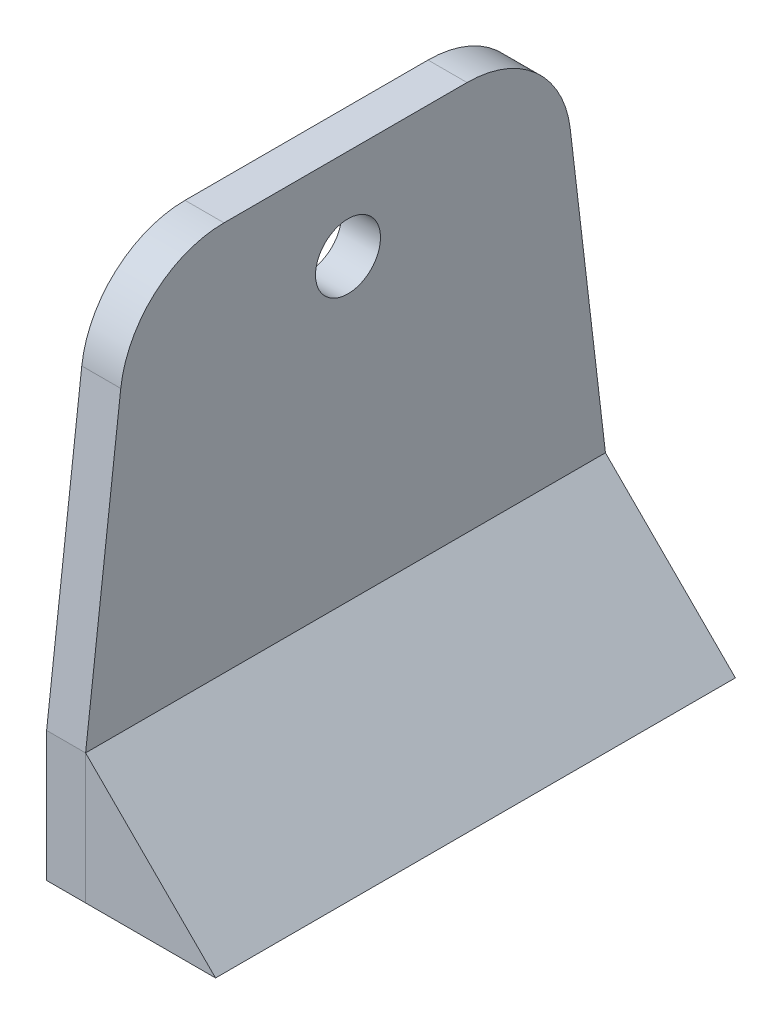
ISO-10303-21;
HEADER;
FILE_DESCRIPTION(('STEP AP214'),'2;1');
FILE_NAME('part.step','',(''),(''),'','','');
FILE_SCHEMA(('AUTOMOTIVE_DESIGN { 1 0 10303 214 1 1 1 1 }'));
ENDSEC;
DATA;
#1=APPLICATION_CONTEXT('core data for automotive mechanical design processes');
#2=APPLICATION_PROTOCOL_DEFINITION('international standard','automotive_design',2000,#1);
#3=PRODUCT_CONTEXT('',#1,'mechanical');
#4=PRODUCT('Part','Part','',(#3));
#5=PRODUCT_RELATED_PRODUCT_CATEGORY('part','',(#4));
#6=PRODUCT_DEFINITION_FORMATION('','',#4);
#7=PRODUCT_DEFINITION_CONTEXT('part definition',#1,'design');
#8=PRODUCT_DEFINITION('design','',#6,#7);
#9=PRODUCT_DEFINITION_SHAPE('','',#8);
#10=(LENGTH_UNIT() NAMED_UNIT(*) SI_UNIT(.MILLI.,.METRE.));
#11=(NAMED_UNIT(*) PLANE_ANGLE_UNIT() SI_UNIT($,.RADIAN.));
#12=(NAMED_UNIT(*) SI_UNIT($,.STERADIAN.) SOLID_ANGLE_UNIT());
#13=UNCERTAINTY_MEASURE_WITH_UNIT(LENGTH_MEASURE(1.E-05),#10,'distance_accuracy_value','');
#14=(GEOMETRIC_REPRESENTATION_CONTEXT(3) GLOBAL_UNCERTAINTY_ASSIGNED_CONTEXT((#13)) GLOBAL_UNIT_ASSIGNED_CONTEXT((#10,
#11,#12)) REPRESENTATION_CONTEXT('',''));
#15=CARTESIAN_POINT('',(0.,0.,0.));
#16=DIRECTION('',(0.,0.,1.));
#17=DIRECTION('',(1.,0.,0.));
#18=AXIS2_PLACEMENT_3D('',#15,#16,#17);
#19=CARTESIAN_POINT('',(-18.65,10.,20.));
#20=DIRECTION('',(1.,0.,0.));
#21=DIRECTION('',(0.,0.,-1.));
#22=AXIS2_PLACEMENT_3D('',#19,#20,#21);
#23=PLANE('',#22);
#24=DIRECTION('',(0.,-1.,0.));
#25=VECTOR('',#24,1.);
#26=CARTESIAN_POINT('',(-18.65,10.,-20.));
#27=LINE('',#26,#25);
#28=CARTESIAN_POINT('',(-18.65,10.,-20.));
#29=VERTEX_POINT('',#28);
#30=CARTESIAN_POINT('',(-18.65,0.,-20.));
#31=VERTEX_POINT('',#30);
#32=EDGE_CURVE('E96',#29,#31,#27,.T.);
#33=ORIENTED_EDGE('',*,*,#32,.T.);
#34=DIRECTION('',(0.,0.,-1.));
#35=VECTOR('',#34,1.);
#36=CARTESIAN_POINT('',(-18.65,0.,20.));
#37=LINE('',#36,#35);
#38=CARTESIAN_POINT('',(-18.65,0.,20.));
#39=VERTEX_POINT('',#38);
#40=EDGE_CURVE('E12',#39,#31,#37,.T.);
#41=ORIENTED_EDGE('',*,*,#40,.F.);
#42=DIRECTION('',(0.,-1.,0.));
#43=VECTOR('',#42,1.);
#44=CARTESIAN_POINT('',(-18.65,10.,20.));
#45=LINE('',#44,#43);
#46=CARTESIAN_POINT('',(-18.65,10.,20.));
#47=VERTEX_POINT('',#46);
#48=EDGE_CURVE('E89',#47,#39,#45,.T.);
#49=ORIENTED_EDGE('',*,*,#48,.F.);
#50=DIRECTION('',(0.,0.,-1.));
#51=VECTOR('',#50,1.);
#52=CARTESIAN_POINT('',(-18.65,10.,20.));
#53=LINE('',#52,#51);
#54=EDGE_CURVE('E97',#47,#29,#53,.T.);
#55=ORIENTED_EDGE('',*,*,#54,.T.);
#56=EDGE_LOOP('',(#33,#41,#49,#55));
#57=FACE_BOUND('',#56,.T.);
#58=ADVANCED_FACE('F49',(#57),#23,.F.);
#59=CARTESIAN_POINT('',(-8.64999999999991,0.,20.));
#60=DIRECTION('',(0.,1.,0.));
#61=DIRECTION('',(-1.,0.,0.));
#62=AXIS2_PLACEMENT_3D('',#59,#60,#61);
#63=PLANE('',#62);
#64=DIRECTION('',(1.,0.,0.));
#65=VECTOR('',#64,1.);
#66=CARTESIAN_POINT('',(-8.64999999999991,0.,-20.));
#67=LINE('',#66,#65);
#68=CARTESIAN_POINT('',(-8.64999999999991,0.,-20.));
#69=VERTEX_POINT('',#68);
#70=EDGE_CURVE('E77',#31,#69,#67,.T.);
#71=ORIENTED_EDGE('',*,*,#70,.T.);
#72=DIRECTION('',(0.,0.,-1.));
#73=VECTOR('',#72,1.);
#74=CARTESIAN_POINT('',(-8.64999999999991,0.,20.));
#75=LINE('',#74,#73);
#76=CARTESIAN_POINT('',(-8.64999999999991,0.,20.));
#77=VERTEX_POINT('',#76);
#78=EDGE_CURVE('E57',#77,#69,#75,.T.);
#79=ORIENTED_EDGE('',*,*,#78,.F.);
#80=DIRECTION('',(1.,0.,0.));
#81=VECTOR('',#80,1.);
#82=CARTESIAN_POINT('',(-8.64999999999991,0.,20.));
#83=LINE('',#82,#81);
#84=EDGE_CURVE('E85',#39,#77,#83,.T.);
#85=ORIENTED_EDGE('',*,*,#84,.F.);
#86=ORIENTED_EDGE('',*,*,#40,.T.);
#87=EDGE_LOOP('',(#71,#79,#85,#86));
#88=FACE_BOUND('',#87,.T.);
#89=ADVANCED_FACE('F86',(#88),#63,.F.);
#90=CARTESIAN_POINT('',(-18.65,10.,20.));
#91=DIRECTION('',(-0.707106781186544,-0.707106781186551,0.));
#92=DIRECTION('',(0.707106781186551,-0.707106781186544,0.));
#93=AXIS2_PLACEMENT_3D('',#90,#91,#92);
#94=PLANE('',#93);
#95=DIRECTION('',(-0.707106781186551,0.707106781186544,0.));
#96=VECTOR('',#95,1.);
#97=CARTESIAN_POINT('',(-18.65,10.,-20.));
#98=LINE('',#97,#96);
#99=EDGE_CURVE('E82',#69,#29,#98,.T.);
#100=ORIENTED_EDGE('',*,*,#99,.T.);
#101=ORIENTED_EDGE('',*,*,#54,.F.);
#102=DIRECTION('',(-0.707106781186551,0.707106781186544,0.));
#103=VECTOR('',#102,1.);
#104=CARTESIAN_POINT('',(-18.65,10.,20.));
#105=LINE('',#104,#103);
#106=EDGE_CURVE('E65',#77,#47,#105,.T.);
#107=ORIENTED_EDGE('',*,*,#106,.F.);
#108=ORIENTED_EDGE('',*,*,#78,.T.);
#109=EDGE_LOOP('',(#100,#101,#107,#108));
#110=FACE_BOUND('',#109,.T.);
#111=ADVANCED_FACE('F104',(#110),#94,.F.);
#112=CARTESIAN_POINT('',(0.,0.,20.));
#113=DIRECTION('',(0.,0.,-1.));
#114=DIRECTION('',(-1.,0.,0.));
#115=AXIS2_PLACEMENT_3D('',#112,#113,#114);
#116=PLANE('',#115);
#117=ORIENTED_EDGE('',*,*,#48,.T.);
#118=ORIENTED_EDGE('',*,*,#84,.T.);
#119=ORIENTED_EDGE('',*,*,#106,.T.);
#120=EDGE_LOOP('',(#117,#118,#119));
#121=FACE_BOUND('',#120,.T.);
#122=ADVANCED_FACE('F92',(#121),#116,.F.);
#123=CARTESIAN_POINT('',(0.,0.,-20.));
#124=DIRECTION('',(0.,0.,-1.));
#125=DIRECTION('',(-1.,0.,0.));
#126=AXIS2_PLACEMENT_3D('',#123,#124,#125);
#127=PLANE('',#126);
#128=ORIENTED_EDGE('',*,*,#32,.F.);
#129=ORIENTED_EDGE('',*,*,#99,.F.);
#130=ORIENTED_EDGE('',*,*,#70,.F.);
#131=EDGE_LOOP('',(#128,#129,#130));
#132=FACE_BOUND('',#131,.T.);
#133=ADVANCED_FACE('F105',(#132),#127,.T.);
#134=CLOSED_SHELL('',(#58,#89,#111,#122,#133));
#135=MANIFOLD_SOLID_BREP('B2',#134);
#136=CARTESIAN_POINT('',(-21.65,32.,-9.34989022448266));
#137=DIRECTION('',(1.,0.,0.));
#138=DIRECTION('',(0.,0.,-1.));
#139=AXIS2_PLACEMENT_3D('',#136,#137,#138);
#140=PLANE('',#139);
#141=DIRECTION('',(0.,0.993116891557434,-0.117127450682147));
#142=VECTOR('',#141,1.);
#143=CARTESIAN_POINT('',(-21.6500000000001,32.9370196054571,17.2948253569421));
#144=LINE('',#143,#142);
#145=CARTESIAN_POINT('',(-21.6500000000001,10.,20.));
#146=VERTEX_POINT('',#145);
#147=CARTESIAN_POINT('',(-21.65,32.9370196054571,17.2948253569421));
#148=VERTEX_POINT('',#147);
#149=EDGE_CURVE('E269',#146,#148,#144,.T.);
#150=ORIENTED_EDGE('',*,*,#149,.T.);
#151=CARTESIAN_POINT('',(-21.65,32.,9.34989022448265));
#152=DIRECTION('',(-1.,0.,0.));
#153=DIRECTION('',(0.,0.,1.));
#154=AXIS2_PLACEMENT_3D('',#151,#152,#153);
#155=CIRCLE('',#154,8.);
#156=CARTESIAN_POINT('',(-21.65,40.,9.3498902244826));
#157=VERTEX_POINT('',#156);
#158=EDGE_CURVE('E217',#148,#157,#155,.T.);
#159=ORIENTED_EDGE('',*,*,#158,.T.);
#160=DIRECTION('',(0.,0.,-1.));
#161=VECTOR('',#160,1.);
#162=CARTESIAN_POINT('',(-21.65,40.,-9.34989022448261));
#163=LINE('',#162,#161);
#164=CARTESIAN_POINT('',(-21.65,40.,-9.34989022448261));
#165=VERTEX_POINT('',#164);
#166=EDGE_CURVE('E284',#157,#165,#163,.T.);
#167=ORIENTED_EDGE('',*,*,#166,.T.);
#168=CARTESIAN_POINT('',(-21.65,32.,-9.34989022448266));
#169=DIRECTION('',(-1.,0.,0.));
#170=DIRECTION('',(0.,0.,-1.));
#171=AXIS2_PLACEMENT_3D('',#168,#169,#170);
#172=CIRCLE('',#171,8.);
#173=CARTESIAN_POINT('',(-21.65,32.9370196054571,-17.2948253569421));
#174=VERTEX_POINT('',#173);
#175=EDGE_CURVE('E297',#165,#174,#172,.T.);
#176=ORIENTED_EDGE('',*,*,#175,.T.);
#177=DIRECTION('',(0.,-0.993116891557435,-0.117127450682147));
#178=VECTOR('',#177,1.);
#179=CARTESIAN_POINT('',(-21.65,10.,-20.));
#180=LINE('',#179,#178);
#181=CARTESIAN_POINT('',(-21.65,10.,-20.));
#182=VERTEX_POINT('',#181);
#183=EDGE_CURVE('E236',#174,#182,#180,.T.);
#184=ORIENTED_EDGE('',*,*,#183,.T.);
#185=DIRECTION('',(0.,-1.,0.));
#186=VECTOR('',#185,1.);
#187=CARTESIAN_POINT('',(-21.65,10.,-20.));
#188=LINE('',#187,#186);
#189=CARTESIAN_POINT('',(-21.65,0.,-20.));
#190=VERTEX_POINT('',#189);
#191=EDGE_CURVE('E230',#182,#190,#188,.T.);
#192=ORIENTED_EDGE('',*,*,#191,.T.);
#193=DIRECTION('',(0.,0.,1.));
#194=VECTOR('',#193,1.);
#195=CARTESIAN_POINT('',(-21.6500000000001,0.,20.));
#196=LINE('',#195,#194);
#197=CARTESIAN_POINT('',(-21.6500000000001,0.,20.));
#198=VERTEX_POINT('',#197);
#199=EDGE_CURVE('E234',#190,#198,#196,.T.);
#200=ORIENTED_EDGE('',*,*,#199,.T.);
#201=DIRECTION('',(0.,1.,0.));
#202=VECTOR('',#201,1.);
#203=CARTESIAN_POINT('',(-21.6500000000001,10.,20.));
#204=LINE('',#203,#202);
#205=EDGE_CURVE('E174',#198,#146,#204,.T.);
#206=ORIENTED_EDGE('',*,*,#205,.T.);
#207=EDGE_LOOP('',(#150,#159,#167,#176,#184,#192,#200,#206));
#208=FACE_BOUND('',#207,.T.);
#209=CARTESIAN_POINT('',(-21.65,32.9999999999821,-0.191504709072019));
#210=DIRECTION('',(-1.,0.,0.));
#211=DIRECTION('',(0.,0.,1.));
#212=AXIS2_PLACEMENT_3D('',#209,#210,#211);
#213=CIRCLE('',#212,2.49999999996479);
#214=CARTESIAN_POINT('',(-21.65,32.9999999999821,2.30849529089277));
#215=VERTEX_POINT('',#214);
#216=EDGE_CURVE('E258',#215,#215,#213,.T.);
#217=ORIENTED_EDGE('',*,*,#216,.F.);
#218=EDGE_LOOP('',(#217));
#219=FACE_BOUND('',#218,.T.);
#220=ADVANCED_FACE('F157',(#208,#219),#140,.F.);
#221=CARTESIAN_POINT('',(-18.65,32.,-9.34989022448266));
#222=DIRECTION('',(1.,0.,0.));
#223=DIRECTION('',(0.,0.,-1.));
#224=AXIS2_PLACEMENT_3D('',#221,#222,#223);
#225=PLANE('',#224);
#226=DIRECTION('',(0.,0.993116891557434,-0.117127450682147));
#227=VECTOR('',#226,1.);
#228=CARTESIAN_POINT('',(-18.6500000000001,32.9370196054571,17.2948253569421));
#229=LINE('',#228,#227);
#230=CARTESIAN_POINT('',(-18.6500000000001,10.,20.));
#231=VERTEX_POINT('',#230);
#232=CARTESIAN_POINT('',(-18.65,32.9370196054571,17.2948253569421));
#233=VERTEX_POINT('',#232);
#234=EDGE_CURVE('E254',#231,#233,#229,.T.);
#235=ORIENTED_EDGE('',*,*,#234,.F.);
#236=DIRECTION('',(0.,1.,0.));
#237=VECTOR('',#236,1.);
#238=CARTESIAN_POINT('',(-18.6500000000001,10.,20.));
#239=LINE('',#238,#237);
#240=CARTESIAN_POINT('',(-18.6500000000001,0.,20.));
#241=VERTEX_POINT('',#240);
#242=EDGE_CURVE('E209',#241,#231,#239,.T.);
#243=ORIENTED_EDGE('',*,*,#242,.F.);
#244=DIRECTION('',(0.,0.,1.));
#245=VECTOR('',#244,1.);
#246=CARTESIAN_POINT('',(-18.6500000000001,0.,20.));
#247=LINE('',#246,#245);
#248=CARTESIAN_POINT('',(-18.65,0.,-20.));
#249=VERTEX_POINT('',#248);
#250=EDGE_CURVE('E203',#249,#241,#247,.T.);
#251=ORIENTED_EDGE('',*,*,#250,.F.);
#252=DIRECTION('',(0.,-1.,0.));
#253=VECTOR('',#252,1.);
#254=CARTESIAN_POINT('',(-18.65,10.,-20.));
#255=LINE('',#254,#253);
#256=CARTESIAN_POINT('',(-18.65,10.,-20.));
#257=VERTEX_POINT('',#256);
#258=EDGE_CURVE('E244',#257,#249,#255,.T.);
#259=ORIENTED_EDGE('',*,*,#258,.F.);
#260=DIRECTION('',(0.,-0.993116891557435,-0.117127450682147));
#261=VECTOR('',#260,1.);
#262=CARTESIAN_POINT('',(-18.65,10.,-20.));
#263=LINE('',#262,#261);
#264=CARTESIAN_POINT('',(-18.65,32.9370196054571,-17.2948253569421));
#265=VERTEX_POINT('',#264);
#266=EDGE_CURVE('E264',#265,#257,#263,.T.);
#267=ORIENTED_EDGE('',*,*,#266,.F.);
#268=CARTESIAN_POINT('',(-18.65,32.,-9.34989022448266));
#269=DIRECTION('',(-1.,0.,0.));
#270=DIRECTION('',(0.,0.,-1.));
#271=AXIS2_PLACEMENT_3D('',#268,#269,#270);
#272=CIRCLE('',#271,8.);
#273=CARTESIAN_POINT('',(-18.65,40.,-9.34989022448261));
#274=VERTEX_POINT('',#273);
#275=EDGE_CURVE('E262',#274,#265,#272,.T.);
#276=ORIENTED_EDGE('',*,*,#275,.F.);
#277=DIRECTION('',(0.,0.,-1.));
#278=VECTOR('',#277,1.);
#279=CARTESIAN_POINT('',(-18.65,40.,-9.34989022448261));
#280=LINE('',#279,#278);
#281=CARTESIAN_POINT('',(-18.65,40.,9.3498902244826));
#282=VERTEX_POINT('',#281);
#283=EDGE_CURVE('E260',#282,#274,#280,.T.);
#284=ORIENTED_EDGE('',*,*,#283,.F.);
#285=CARTESIAN_POINT('',(-18.65,32.,9.34989022448265));
#286=DIRECTION('',(-1.,0.,0.));
#287=DIRECTION('',(0.,0.,1.));
#288=AXIS2_PLACEMENT_3D('',#285,#286,#287);
#289=CIRCLE('',#288,8.);
#290=EDGE_CURVE('E257',#233,#282,#289,.T.);
#291=ORIENTED_EDGE('',*,*,#290,.F.);
#292=EDGE_LOOP('',(#235,#243,#251,#259,#267,#276,#284,#291));
#293=FACE_BOUND('',#292,.T.);
#294=CARTESIAN_POINT('',(-18.65,32.9999999999821,-0.191504709072019));
#295=DIRECTION('',(-1.,0.,0.));
#296=DIRECTION('',(0.,0.,1.));
#297=AXIS2_PLACEMENT_3D('',#294,#295,#296);
#298=CIRCLE('',#297,2.49999999996479);
#299=CARTESIAN_POINT('',(-18.65,32.9999999999821,2.30849529089277));
#300=VERTEX_POINT('',#299);
#301=EDGE_CURVE('E303',#300,#300,#298,.T.);
#302=ORIENTED_EDGE('',*,*,#301,.T.);
#303=EDGE_LOOP('',(#302));
#304=FACE_BOUND('',#303,.T.);
#305=ADVANCED_FACE('F288',(#293,#304),#225,.T.);
#306=CARTESIAN_POINT('',(-21.6500000000001,32.9370196054571,17.2948253569421));
#307=DIRECTION('',(0.,-0.117127450682147,-0.993116891557435));
#308=DIRECTION('',(0.,0.993116891557435,-0.117127450682147));
#309=AXIS2_PLACEMENT_3D('',#306,#307,#308);
#310=PLANE('',#309);
#311=ORIENTED_EDGE('',*,*,#234,.T.);
#312=DIRECTION('',(1.,0.,0.));
#313=VECTOR('',#312,1.);
#314=CARTESIAN_POINT('',(-21.65,32.9370196054571,17.2948253569421));
#315=LINE('',#314,#313);
#316=EDGE_CURVE('E47',#148,#233,#315,.T.);
#317=ORIENTED_EDGE('',*,*,#316,.F.);
#318=ORIENTED_EDGE('',*,*,#149,.F.);
#319=DIRECTION('',(1.,0.,0.));
#320=VECTOR('',#319,1.);
#321=CARTESIAN_POINT('',(-21.6500000000001,10.,20.));
#322=LINE('',#321,#320);
#323=EDGE_CURVE('E250',#146,#231,#322,.T.);
#324=ORIENTED_EDGE('',*,*,#323,.T.);
#325=EDGE_LOOP('',(#311,#317,#318,#324));
#326=FACE_BOUND('',#325,.T.);
#327=ADVANCED_FACE('F159',(#326),#310,.F.);
#328=CARTESIAN_POINT('',(-21.65,32.,9.34989022448265));
#329=DIRECTION('',(1.,0.,0.));
#330=DIRECTION('',(0.,0.,-1.));
#331=AXIS2_PLACEMENT_3D('',#328,#329,#330);
#332=CYLINDRICAL_SURFACE('',#331,8.);
#333=ORIENTED_EDGE('',*,*,#290,.T.);
#334=DIRECTION('',(1.,0.,0.));
#335=VECTOR('',#334,1.);
#336=CARTESIAN_POINT('',(-21.65,40.,9.3498902244826));
#337=LINE('',#336,#335);
#338=EDGE_CURVE('E166',#157,#282,#337,.T.);
#339=ORIENTED_EDGE('',*,*,#338,.F.);
#340=ORIENTED_EDGE('',*,*,#158,.F.);
#341=ORIENTED_EDGE('',*,*,#316,.T.);
#342=EDGE_LOOP('',(#333,#339,#340,#341));
#343=FACE_BOUND('',#342,.T.);
#344=ADVANCED_FACE('F331',(#343),#332,.T.);
#345=CARTESIAN_POINT('',(-21.65,40.,-9.34989022448261));
#346=DIRECTION('',(0.,-1.,0.));
#347=DIRECTION('',(0.,0.,-1.));
#348=AXIS2_PLACEMENT_3D('',#345,#346,#347);
#349=PLANE('',#348);
#350=ORIENTED_EDGE('',*,*,#283,.T.);
#351=DIRECTION('',(1.,0.,0.));
#352=VECTOR('',#351,1.);
#353=CARTESIAN_POINT('',(-21.65,40.,-9.34989022448261));
#354=LINE('',#353,#352);
#355=EDGE_CURVE('E276',#165,#274,#354,.T.);
#356=ORIENTED_EDGE('',*,*,#355,.F.);
#357=ORIENTED_EDGE('',*,*,#166,.F.);
#358=ORIENTED_EDGE('',*,*,#338,.T.);
#359=EDGE_LOOP('',(#350,#356,#357,#358));
#360=FACE_BOUND('',#359,.T.);
#361=ADVANCED_FACE('F282',(#360),#349,.F.);
#362=CARTESIAN_POINT('',(-21.65,32.,-9.34989022448266));
#363=DIRECTION('',(1.,0.,0.));
#364=DIRECTION('',(0.,0.,-1.));
#365=AXIS2_PLACEMENT_3D('',#362,#363,#364);
#366=CYLINDRICAL_SURFACE('',#365,8.);
#367=ORIENTED_EDGE('',*,*,#275,.T.);
#368=DIRECTION('',(1.,0.,0.));
#369=VECTOR('',#368,1.);
#370=CARTESIAN_POINT('',(-21.65,32.9370196054571,-17.2948253569421));
#371=LINE('',#370,#369);
#372=EDGE_CURVE('E273',#174,#265,#371,.T.);
#373=ORIENTED_EDGE('',*,*,#372,.F.);
#374=ORIENTED_EDGE('',*,*,#175,.F.);
#375=ORIENTED_EDGE('',*,*,#355,.T.);
#376=EDGE_LOOP('',(#367,#373,#374,#375));
#377=FACE_BOUND('',#376,.T.);
#378=ADVANCED_FACE('F293',(#377),#366,.T.);
#379=CARTESIAN_POINT('',(-21.65,10.,-20.));
#380=DIRECTION('',(0.,-0.117127450682147,0.993116891557435));
#381=DIRECTION('',(0.,-0.993116891557435,-0.117127450682147));
#382=AXIS2_PLACEMENT_3D('',#379,#380,#381);
#383=PLANE('',#382);
#384=ORIENTED_EDGE('',*,*,#266,.T.);
#385=DIRECTION('',(1.,0.,0.));
#386=VECTOR('',#385,1.);
#387=CARTESIAN_POINT('',(-21.65,10.,-20.));
#388=LINE('',#387,#386);
#389=EDGE_CURVE('E245',#182,#257,#388,.T.);
#390=ORIENTED_EDGE('',*,*,#389,.F.);
#391=ORIENTED_EDGE('',*,*,#183,.F.);
#392=ORIENTED_EDGE('',*,*,#372,.T.);
#393=EDGE_LOOP('',(#384,#390,#391,#392));
#394=FACE_BOUND('',#393,.T.);
#395=ADVANCED_FACE('F296',(#394),#383,.F.);
#396=CARTESIAN_POINT('',(-21.65,10.,-20.));
#397=DIRECTION('',(0.,0.,1.));
#398=DIRECTION('',(0.,-1.,0.));
#399=AXIS2_PLACEMENT_3D('',#396,#397,#398);
#400=PLANE('',#399);
#401=ORIENTED_EDGE('',*,*,#258,.T.);
#402=DIRECTION('',(1.,0.,0.));
#403=VECTOR('',#402,1.);
#404=CARTESIAN_POINT('',(-21.65,0.,-20.));
#405=LINE('',#404,#403);
#406=EDGE_CURVE('E241',#190,#249,#405,.T.);
#407=ORIENTED_EDGE('',*,*,#406,.F.);
#408=ORIENTED_EDGE('',*,*,#191,.F.);
#409=ORIENTED_EDGE('',*,*,#389,.T.);
#410=EDGE_LOOP('',(#401,#407,#408,#409));
#411=FACE_BOUND('',#410,.T.);
#412=ADVANCED_FACE('F242',(#411),#400,.F.);
#413=CARTESIAN_POINT('',(-21.6500000000001,0.,20.));
#414=DIRECTION('',(0.,1.,0.));
#415=DIRECTION('',(-1.,0.,0.));
#416=AXIS2_PLACEMENT_3D('',#413,#414,#415);
#417=PLANE('',#416);
#418=ORIENTED_EDGE('',*,*,#250,.T.);
#419=DIRECTION('',(1.,0.,0.));
#420=VECTOR('',#419,1.);
#421=CARTESIAN_POINT('',(-21.6500000000001,0.,20.));
#422=LINE('',#421,#420);
#423=EDGE_CURVE('E246',#198,#241,#422,.T.);
#424=ORIENTED_EDGE('',*,*,#423,.F.);
#425=ORIENTED_EDGE('',*,*,#199,.F.);
#426=ORIENTED_EDGE('',*,*,#406,.T.);
#427=EDGE_LOOP('',(#418,#424,#425,#426));
#428=FACE_BOUND('',#427,.T.);
#429=ADVANCED_FACE('F248',(#428),#417,.F.);
#430=CARTESIAN_POINT('',(-21.6500000000001,10.,20.));
#431=DIRECTION('',(0.,0.,-1.));
#432=DIRECTION('',(0.,1.,0.));
#433=AXIS2_PLACEMENT_3D('',#430,#431,#432);
#434=PLANE('',#433);
#435=ORIENTED_EDGE('',*,*,#242,.T.);
#436=ORIENTED_EDGE('',*,*,#323,.F.);
#437=ORIENTED_EDGE('',*,*,#205,.F.);
#438=ORIENTED_EDGE('',*,*,#423,.T.);
#439=EDGE_LOOP('',(#435,#436,#437,#438));
#440=FACE_BOUND('',#439,.T.);
#441=ADVANCED_FACE('F319',(#440),#434,.F.);
#442=CARTESIAN_POINT('',(-21.65,32.9999999999821,-0.191504709072019));
#443=DIRECTION('',(1.,0.,0.));
#444=DIRECTION('',(0.,0.,-1.));
#445=AXIS2_PLACEMENT_3D('',#442,#443,#444);
#446=CYLINDRICAL_SURFACE('',#445,2.49999999996479);
#447=ORIENTED_EDGE('',*,*,#216,.T.);
#448=EDGE_LOOP('',(#447));
#449=FACE_BOUND('',#448,.T.);
#450=ORIENTED_EDGE('',*,*,#301,.F.);
#451=EDGE_LOOP('',(#450));
#452=FACE_BOUND('',#451,.T.);
#453=ADVANCED_FACE('F309',(#449,#452),#446,.F.);
#454=CLOSED_SHELL('',(#220,#305,#327,#344,#361,#378,#395,#412,#429,#441,#453));
#455=MANIFOLD_SOLID_BREP('B6',#454);
#456=ADVANCED_BREP_SHAPE_REPRESENTATION('',(#18,#135,#455),#14);
#457=SHAPE_DEFINITION_REPRESENTATION(#9,#456);
ENDSEC;
END-ISO-10303-21;
